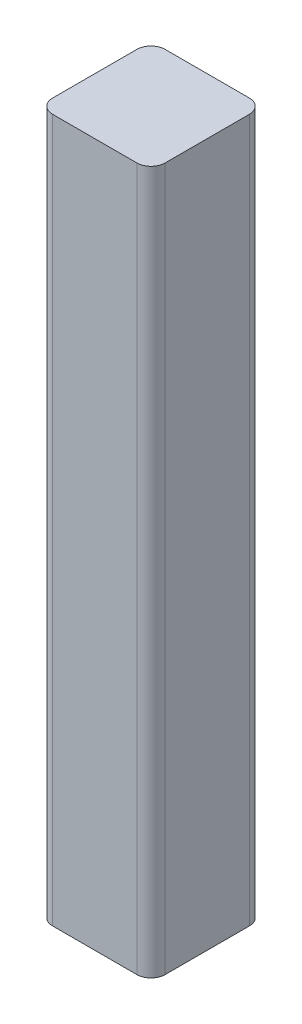
ISO-10303-21;
HEADER;
FILE_DESCRIPTION(('STEP AP214'),'2;1');
FILE_NAME('part.step','',(''),(''),'','','');
FILE_SCHEMA(('AUTOMOTIVE_DESIGN { 1 0 10303 214 1 1 1 1 }'));
ENDSEC;
DATA;
#1=APPLICATION_CONTEXT('core data for automotive mechanical design processes');
#2=APPLICATION_PROTOCOL_DEFINITION('international standard','automotive_design',2000,#1);
#3=PRODUCT_CONTEXT('',#1,'mechanical');
#4=PRODUCT('Part','Part','',(#3));
#5=PRODUCT_RELATED_PRODUCT_CATEGORY('part','',(#4));
#6=PRODUCT_DEFINITION_FORMATION('','',#4);
#7=PRODUCT_DEFINITION_CONTEXT('part definition',#1,'design');
#8=PRODUCT_DEFINITION('design','',#6,#7);
#9=PRODUCT_DEFINITION_SHAPE('','',#8);
#10=(LENGTH_UNIT() NAMED_UNIT(*) SI_UNIT(.MILLI.,.METRE.));
#11=(NAMED_UNIT(*) PLANE_ANGLE_UNIT() SI_UNIT($,.RADIAN.));
#12=(NAMED_UNIT(*) SI_UNIT($,.STERADIAN.) SOLID_ANGLE_UNIT());
#13=UNCERTAINTY_MEASURE_WITH_UNIT(LENGTH_MEASURE(1.E-05),#10,'distance_accuracy_value','');
#14=(GEOMETRIC_REPRESENTATION_CONTEXT(3) GLOBAL_UNCERTAINTY_ASSIGNED_CONTEXT((#13)) GLOBAL_UNIT_ASSIGNED_CONTEXT((#10,
#11,#12)) REPRESENTATION_CONTEXT('',''));
#15=CARTESIAN_POINT('',(0.,0.,0.));
#16=DIRECTION('',(0.,0.,1.));
#17=DIRECTION('',(1.,0.,0.));
#18=AXIS2_PLACEMENT_3D('',#15,#16,#17);
#19=CARTESIAN_POINT('',(20.,250.,20.));
#20=DIRECTION('',(-1.,0.,0.));
#21=DIRECTION('',(0.,0.,1.));
#22=AXIS2_PLACEMENT_3D('',#19,#20,#21);
#23=PLANE('',#22);
#24=DIRECTION('',(0.,0.,-1.));
#25=VECTOR('',#24,1.);
#26=CARTESIAN_POINT('',(20.,0.,20.));
#27=LINE('',#26,#25);
#28=CARTESIAN_POINT('',(20.,0.,15.));
#29=VERTEX_POINT('',#28);
#30=CARTESIAN_POINT('',(20.,0.,-15.));
#31=VERTEX_POINT('',#30);
#32=EDGE_CURVE('E159',#29,#31,#27,.T.);
#33=ORIENTED_EDGE('',*,*,#32,.T.);
#34=DIRECTION('',(0.,-1.,0.));
#35=VECTOR('',#34,1.);
#36=CARTESIAN_POINT('',(20.,250.,-15.));
#37=LINE('',#36,#35);
#38=CARTESIAN_POINT('',(20.,250.,-15.));
#39=VERTEX_POINT('',#38);
#40=EDGE_CURVE('E11',#31,#39,#37,.F.);
#41=ORIENTED_EDGE('',*,*,#40,.T.);
#42=DIRECTION('',(0.,0.,-1.));
#43=VECTOR('',#42,1.);
#44=CARTESIAN_POINT('',(20.,250.,20.));
#45=LINE('',#44,#43);
#46=CARTESIAN_POINT('',(20.,250.,15.));
#47=VERTEX_POINT('',#46);
#48=EDGE_CURVE('E127',#47,#39,#45,.T.);
#49=ORIENTED_EDGE('',*,*,#48,.F.);
#50=DIRECTION('',(0.,-1.,0.));
#51=VECTOR('',#50,1.);
#52=CARTESIAN_POINT('',(20.,250.,15.));
#53=LINE('',#52,#51);
#54=EDGE_CURVE('E43',#47,#29,#53,.T.);
#55=ORIENTED_EDGE('',*,*,#54,.T.);
#56=EDGE_LOOP('',(#33,#41,#49,#55));
#57=FACE_BOUND('',#56,.T.);
#58=ADVANCED_FACE('F35',(#57),#23,.F.);
#59=CARTESIAN_POINT('',(-20.,250.,-20.));
#60=DIRECTION('',(0.,0.,1.));
#61=DIRECTION('',(1.,0.,0.));
#62=AXIS2_PLACEMENT_3D('',#59,#60,#61);
#63=PLANE('',#62);
#64=DIRECTION('',(-1.,0.,0.));
#65=VECTOR('',#64,1.);
#66=CARTESIAN_POINT('',(-20.,0.,-20.));
#67=LINE('',#66,#65);
#68=CARTESIAN_POINT('',(15.,0.,-20.));
#69=VERTEX_POINT('',#68);
#70=CARTESIAN_POINT('',(-15.,0.,-20.));
#71=VERTEX_POINT('',#70);
#72=EDGE_CURVE('E132',#69,#71,#67,.T.);
#73=ORIENTED_EDGE('',*,*,#72,.T.);
#74=DIRECTION('',(0.,-1.,0.));
#75=VECTOR('',#74,1.);
#76=CARTESIAN_POINT('',(-15.,250.,-20.));
#77=LINE('',#76,#75);
#78=CARTESIAN_POINT('',(-15.,250.,-20.));
#79=VERTEX_POINT('',#78);
#80=EDGE_CURVE('E50',#71,#79,#77,.F.);
#81=ORIENTED_EDGE('',*,*,#80,.T.);
#82=DIRECTION('',(-1.,0.,0.));
#83=VECTOR('',#82,1.);
#84=CARTESIAN_POINT('',(-20.,250.,-20.));
#85=LINE('',#84,#83);
#86=CARTESIAN_POINT('',(15.,250.,-20.));
#87=VERTEX_POINT('',#86);
#88=EDGE_CURVE('E130',#87,#79,#85,.T.);
#89=ORIENTED_EDGE('',*,*,#88,.F.);
#90=DIRECTION('',(0.,-1.,0.));
#91=VECTOR('',#90,1.);
#92=CARTESIAN_POINT('',(15.,250.,-20.));
#93=LINE('',#92,#91);
#94=EDGE_CURVE('E151',#87,#69,#93,.T.);
#95=ORIENTED_EDGE('',*,*,#94,.T.);
#96=EDGE_LOOP('',(#73,#81,#89,#95));
#97=FACE_BOUND('',#96,.T.);
#98=ADVANCED_FACE('F179',(#97),#63,.F.);
#99=CARTESIAN_POINT('',(-20.,250.,20.));
#100=DIRECTION('',(1.,0.,0.));
#101=DIRECTION('',(0.,0.,-1.));
#102=AXIS2_PLACEMENT_3D('',#99,#100,#101);
#103=PLANE('',#102);
#104=DIRECTION('',(0.,0.,1.));
#105=VECTOR('',#104,1.);
#106=CARTESIAN_POINT('',(-20.,0.,20.));
#107=LINE('',#106,#105);
#108=CARTESIAN_POINT('',(-20.,0.,-15.));
#109=VERTEX_POINT('',#108);
#110=CARTESIAN_POINT('',(-20.,0.,15.));
#111=VERTEX_POINT('',#110);
#112=EDGE_CURVE('E128',#109,#111,#107,.T.);
#113=ORIENTED_EDGE('',*,*,#112,.T.);
#114=DIRECTION('',(0.,-1.,0.));
#115=VECTOR('',#114,1.);
#116=CARTESIAN_POINT('',(-20.,250.,15.));
#117=LINE('',#116,#115);
#118=CARTESIAN_POINT('',(-20.,250.,15.));
#119=VERTEX_POINT('',#118);
#120=EDGE_CURVE('E106',#111,#119,#117,.F.);
#121=ORIENTED_EDGE('',*,*,#120,.T.);
#122=DIRECTION('',(0.,0.,1.));
#123=VECTOR('',#122,1.);
#124=CARTESIAN_POINT('',(-20.,250.,20.));
#125=LINE('',#124,#123);
#126=CARTESIAN_POINT('',(-20.,250.,-15.));
#127=VERTEX_POINT('',#126);
#128=EDGE_CURVE('E167',#127,#119,#125,.T.);
#129=ORIENTED_EDGE('',*,*,#128,.F.);
#130=DIRECTION('',(0.,-1.,0.));
#131=VECTOR('',#130,1.);
#132=CARTESIAN_POINT('',(-20.,250.,-15.));
#133=LINE('',#132,#131);
#134=EDGE_CURVE('E111',#127,#109,#133,.T.);
#135=ORIENTED_EDGE('',*,*,#134,.T.);
#136=EDGE_LOOP('',(#113,#121,#129,#135));
#137=FACE_BOUND('',#136,.T.);
#138=ADVANCED_FACE('F178',(#137),#103,.F.);
#139=CARTESIAN_POINT('',(-20.,250.,20.));
#140=DIRECTION('',(0.,0.,-1.));
#141=DIRECTION('',(-1.,0.,0.));
#142=AXIS2_PLACEMENT_3D('',#139,#140,#141);
#143=PLANE('',#142);
#144=DIRECTION('',(1.,0.,0.));
#145=VECTOR('',#144,1.);
#146=CARTESIAN_POINT('',(-20.,250.,20.));
#147=LINE('',#146,#145);
#148=CARTESIAN_POINT('',(-15.,250.,20.));
#149=VERTEX_POINT('',#148);
#150=CARTESIAN_POINT('',(15.,250.,20.));
#151=VERTEX_POINT('',#150);
#152=EDGE_CURVE('E121',#149,#151,#147,.T.);
#153=ORIENTED_EDGE('',*,*,#152,.F.);
#154=DIRECTION('',(0.,-1.,0.));
#155=VECTOR('',#154,1.);
#156=CARTESIAN_POINT('',(-15.,250.,20.));
#157=LINE('',#156,#155);
#158=CARTESIAN_POINT('',(-15.,0.,20.));
#159=VERTEX_POINT('',#158);
#160=EDGE_CURVE('E105',#149,#159,#157,.T.);
#161=ORIENTED_EDGE('',*,*,#160,.T.);
#162=DIRECTION('',(1.,0.,0.));
#163=VECTOR('',#162,1.);
#164=CARTESIAN_POINT('',(-20.,0.,20.));
#165=LINE('',#164,#163);
#166=CARTESIAN_POINT('',(15.,0.,20.));
#167=VERTEX_POINT('',#166);
#168=EDGE_CURVE('E118',#159,#167,#165,.T.);
#169=ORIENTED_EDGE('',*,*,#168,.T.);
#170=DIRECTION('',(0.,-1.,0.));
#171=VECTOR('',#170,1.);
#172=CARTESIAN_POINT('',(15.,250.,20.));
#173=LINE('',#172,#171);
#174=EDGE_CURVE('E123',#167,#151,#173,.F.);
#175=ORIENTED_EDGE('',*,*,#174,.T.);
#176=EDGE_LOOP('',(#153,#161,#169,#175));
#177=FACE_BOUND('',#176,.T.);
#178=ADVANCED_FACE('F117',(#177),#143,.F.);
#179=CARTESIAN_POINT('',(0.,250.,0.));
#180=DIRECTION('',(0.,-1.,0.));
#181=DIRECTION('',(0.,0.,-1.));
#182=AXIS2_PLACEMENT_3D('',#179,#180,#181);
#183=PLANE('',#182);
#184=ORIENTED_EDGE('',*,*,#128,.T.);
#185=CARTESIAN_POINT('',(-15.,250.,15.));
#186=DIRECTION('',(0.,-1.,0.));
#187=DIRECTION('',(0.,0.,-1.));
#188=AXIS2_PLACEMENT_3D('',#185,#186,#187);
#189=CIRCLE('',#188,5.);
#190=EDGE_CURVE('E149',#119,#149,#189,.F.);
#191=ORIENTED_EDGE('',*,*,#190,.T.);
#192=ORIENTED_EDGE('',*,*,#152,.T.);
#193=CARTESIAN_POINT('',(15.,250.,15.));
#194=DIRECTION('',(0.,-1.,0.));
#195=DIRECTION('',(0.,0.,-1.));
#196=AXIS2_PLACEMENT_3D('',#193,#194,#195);
#197=CIRCLE('',#196,5.);
#198=EDGE_CURVE('E144',#151,#47,#197,.F.);
#199=ORIENTED_EDGE('',*,*,#198,.T.);
#200=ORIENTED_EDGE('',*,*,#48,.T.);
#201=CARTESIAN_POINT('',(15.,250.,-15.));
#202=DIRECTION('',(0.,-1.,0.));
#203=DIRECTION('',(0.,0.,-1.));
#204=AXIS2_PLACEMENT_3D('',#201,#202,#203);
#205=CIRCLE('',#204,5.);
#206=EDGE_CURVE('E57',#39,#87,#205,.F.);
#207=ORIENTED_EDGE('',*,*,#206,.T.);
#208=ORIENTED_EDGE('',*,*,#88,.T.);
#209=CARTESIAN_POINT('',(-15.,250.,-15.));
#210=DIRECTION('',(0.,-1.,0.));
#211=DIRECTION('',(0.,0.,-1.));
#212=AXIS2_PLACEMENT_3D('',#209,#210,#211);
#213=CIRCLE('',#212,5.);
#214=EDGE_CURVE('E147',#79,#127,#213,.F.);
#215=ORIENTED_EDGE('',*,*,#214,.T.);
#216=EDGE_LOOP('',(#184,#191,#192,#199,#200,#207,#208,#215));
#217=FACE_BOUND('',#216,.T.);
#218=ADVANCED_FACE('F171',(#217),#183,.F.);
#219=CARTESIAN_POINT('',(0.,0.,0.));
#220=DIRECTION('',(0.,-1.,0.));
#221=DIRECTION('',(0.,0.,-1.));
#222=AXIS2_PLACEMENT_3D('',#219,#220,#221);
#223=PLANE('',#222);
#224=ORIENTED_EDGE('',*,*,#168,.F.);
#225=CARTESIAN_POINT('',(-15.,0.,15.));
#226=DIRECTION('',(0.,-1.,0.));
#227=DIRECTION('',(0.,0.,-1.));
#228=AXIS2_PLACEMENT_3D('',#225,#226,#227);
#229=CIRCLE('',#228,5.);
#230=EDGE_CURVE('E101',#159,#111,#229,.T.);
#231=ORIENTED_EDGE('',*,*,#230,.T.);
#232=ORIENTED_EDGE('',*,*,#112,.F.);
#233=CARTESIAN_POINT('',(-15.,0.,-15.));
#234=DIRECTION('',(0.,-1.,0.));
#235=DIRECTION('',(0.,0.,-1.));
#236=AXIS2_PLACEMENT_3D('',#233,#234,#235);
#237=CIRCLE('',#236,5.);
#238=EDGE_CURVE('E112',#109,#71,#237,.T.);
#239=ORIENTED_EDGE('',*,*,#238,.T.);
#240=ORIENTED_EDGE('',*,*,#72,.F.);
#241=CARTESIAN_POINT('',(15.,0.,-15.));
#242=DIRECTION('',(0.,-1.,0.));
#243=DIRECTION('',(0.,0.,-1.));
#244=AXIS2_PLACEMENT_3D('',#241,#242,#243);
#245=CIRCLE('',#244,5.);
#246=EDGE_CURVE('E138',#69,#31,#245,.T.);
#247=ORIENTED_EDGE('',*,*,#246,.T.);
#248=ORIENTED_EDGE('',*,*,#32,.F.);
#249=CARTESIAN_POINT('',(15.,0.,15.));
#250=DIRECTION('',(0.,-1.,0.));
#251=DIRECTION('',(0.,0.,-1.));
#252=AXIS2_PLACEMENT_3D('',#249,#250,#251);
#253=CIRCLE('',#252,5.);
#254=EDGE_CURVE('E122',#29,#167,#253,.T.);
#255=ORIENTED_EDGE('',*,*,#254,.T.);
#256=EDGE_LOOP('',(#224,#231,#232,#239,#240,#247,#248,#255));
#257=FACE_BOUND('',#256,.T.);
#258=ADVANCED_FACE('F125',(#257),#223,.T.);
#259=CARTESIAN_POINT('',(-15.,250.,15.));
#260=DIRECTION('',(0.,-1.,0.));
#261=DIRECTION('',(0.,0.,-1.));
#262=AXIS2_PLACEMENT_3D('',#259,#260,#261);
#263=CYLINDRICAL_SURFACE('',#262,5.);
#264=ORIENTED_EDGE('',*,*,#190,.F.);
#265=ORIENTED_EDGE('',*,*,#120,.F.);
#266=ORIENTED_EDGE('',*,*,#230,.F.);
#267=ORIENTED_EDGE('',*,*,#160,.F.);
#268=EDGE_LOOP('',(#264,#265,#266,#267));
#269=FACE_BOUND('',#268,.T.);
#270=ADVANCED_FACE('F104',(#269),#263,.T.);
#271=CARTESIAN_POINT('',(-15.,250.,-15.));
#272=DIRECTION('',(0.,-1.,0.));
#273=DIRECTION('',(0.,0.,-1.));
#274=AXIS2_PLACEMENT_3D('',#271,#272,#273);
#275=CYLINDRICAL_SURFACE('',#274,5.);
#276=ORIENTED_EDGE('',*,*,#214,.F.);
#277=ORIENTED_EDGE('',*,*,#80,.F.);
#278=ORIENTED_EDGE('',*,*,#238,.F.);
#279=ORIENTED_EDGE('',*,*,#134,.F.);
#280=EDGE_LOOP('',(#276,#277,#278,#279));
#281=FACE_BOUND('',#280,.T.);
#282=ADVANCED_FACE('F176',(#281),#275,.T.);
#283=CARTESIAN_POINT('',(15.,250.,-15.));
#284=DIRECTION('',(0.,-1.,0.));
#285=DIRECTION('',(0.,0.,-1.));
#286=AXIS2_PLACEMENT_3D('',#283,#284,#285);
#287=CYLINDRICAL_SURFACE('',#286,5.);
#288=ORIENTED_EDGE('',*,*,#206,.F.);
#289=ORIENTED_EDGE('',*,*,#40,.F.);
#290=ORIENTED_EDGE('',*,*,#246,.F.);
#291=ORIENTED_EDGE('',*,*,#94,.F.);
#292=EDGE_LOOP('',(#288,#289,#290,#291));
#293=FACE_BOUND('',#292,.T.);
#294=ADVANCED_FACE('F181',(#293),#287,.T.);
#295=CARTESIAN_POINT('',(15.,250.,15.));
#296=DIRECTION('',(0.,-1.,0.));
#297=DIRECTION('',(0.,0.,-1.));
#298=AXIS2_PLACEMENT_3D('',#295,#296,#297);
#299=CYLINDRICAL_SURFACE('',#298,5.);
#300=ORIENTED_EDGE('',*,*,#198,.F.);
#301=ORIENTED_EDGE('',*,*,#174,.F.);
#302=ORIENTED_EDGE('',*,*,#254,.F.);
#303=ORIENTED_EDGE('',*,*,#54,.F.);
#304=EDGE_LOOP('',(#300,#301,#302,#303));
#305=FACE_BOUND('',#304,.T.);
#306=ADVANCED_FACE('F37',(#305),#299,.T.);
#307=CLOSED_SHELL('',(#58,#98,#138,#178,#218,#258,#270,#282,#294,#306));
#308=MANIFOLD_SOLID_BREP('B2',#307);
#309=ADVANCED_BREP_SHAPE_REPRESENTATION('',(#18,#308),#14);
#310=SHAPE_DEFINITION_REPRESENTATION(#9,#309);
ENDSEC;
END-ISO-10303-21;
